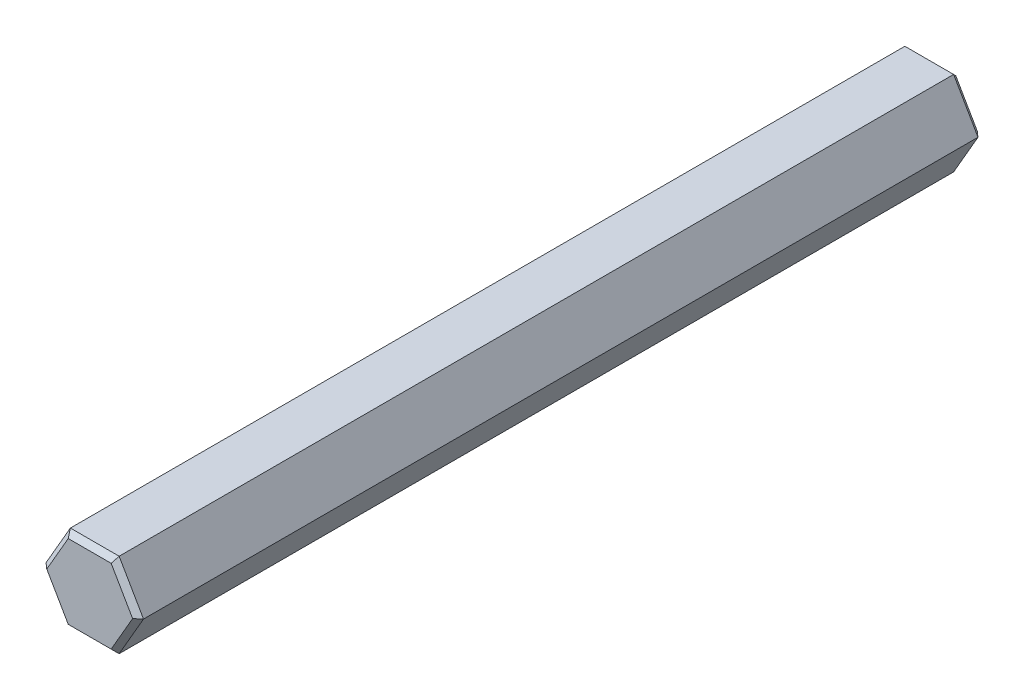
ISO-10303-21;
HEADER;
FILE_DESCRIPTION(('STEP AP214'),'2;1');
FILE_NAME('part.step','',(''),(''),'','','');
FILE_SCHEMA(('AUTOMOTIVE_DESIGN { 1 0 10303 214 1 1 1 1 }'));
ENDSEC;
DATA;
#1=APPLICATION_CONTEXT('core data for automotive mechanical design processes');
#2=APPLICATION_PROTOCOL_DEFINITION('international standard','automotive_design',2000,#1);
#3=PRODUCT_CONTEXT('',#1,'mechanical');
#4=PRODUCT('Part','Part','',(#3));
#5=PRODUCT_RELATED_PRODUCT_CATEGORY('part','',(#4));
#6=PRODUCT_DEFINITION_FORMATION('','',#4);
#7=PRODUCT_DEFINITION_CONTEXT('part definition',#1,'design');
#8=PRODUCT_DEFINITION('design','',#6,#7);
#9=PRODUCT_DEFINITION_SHAPE('','',#8);
#10=(LENGTH_UNIT() NAMED_UNIT(*) SI_UNIT(.MILLI.,.METRE.));
#11=(NAMED_UNIT(*) PLANE_ANGLE_UNIT() SI_UNIT($,.RADIAN.));
#12=(NAMED_UNIT(*) SI_UNIT($,.STERADIAN.) SOLID_ANGLE_UNIT());
#13=UNCERTAINTY_MEASURE_WITH_UNIT(LENGTH_MEASURE(1.E-05),#10,'distance_accuracy_value','');
#14=(GEOMETRIC_REPRESENTATION_CONTEXT(3) GLOBAL_UNCERTAINTY_ASSIGNED_CONTEXT((#13)) GLOBAL_UNIT_ASSIGNED_CONTEXT((#10,
#11,#12)) REPRESENTATION_CONTEXT('',''));
#15=CARTESIAN_POINT('',(0.,0.,0.));
#16=DIRECTION('',(0.,0.,1.));
#17=DIRECTION('',(1.,0.,0.));
#18=AXIS2_PLACEMENT_3D('',#15,#16,#17);
#19=CARTESIAN_POINT('',(-4.2527620828508,-4.572,0.381));
#20=DIRECTION('',(-0.612372435695795,-0.353553390593274,-0.707106781186548));
#21=DIRECTION('',(-0.755928946018454,0.,0.654653670707977));
#22=AXIS2_PLACEMENT_3D('',#19,#20,#21);
#23=PLANE('',#22);
#24=DIRECTION('',(0.499999999999998,-0.86602540378444,0.));
#25=VECTOR('',#24,1.);
#26=CARTESIAN_POINT('',(-6.45246660846325,0.,0.));
#27=LINE('',#26,#25);
#28=CARTESIAN_POINT('',(-6.45246660846325,0.,0.));
#29=VERTEX_POINT('',#28);
#30=CARTESIAN_POINT('',(-3.22623330423164,-5.588,0.));
#31=VERTEX_POINT('',#30);
#32=EDGE_CURVE('E104',#29,#31,#27,.T.);
#33=ORIENTED_EDGE('',*,*,#32,.T.);
#34=DIRECTION('',(0.377964473009231,0.654653670707976,-0.654653670707976));
#35=VECTOR('',#34,1.);
#36=CARTESIAN_POINT('',(-3.66617420935414,-6.35,0.762000000000001));
#37=LINE('',#36,#35);
#38=CARTESIAN_POINT('',(-3.66617420935414,-6.35,0.762000000000001));
#39=VERTEX_POINT('',#38);
#40=EDGE_CURVE('E146',#39,#31,#37,.T.);
#41=ORIENTED_EDGE('',*,*,#40,.F.);
#42=DIRECTION('',(0.5,-0.866025403784439,0.));
#43=VECTOR('',#42,1.);
#44=CARTESIAN_POINT('',(-3.66617420935414,-6.35,0.762000000000001));
#45=LINE('',#44,#43);
#46=CARTESIAN_POINT('',(-7.33234841870825,0.,0.761999999999996));
#47=VERTEX_POINT('',#46);
#48=EDGE_CURVE('E109',#47,#39,#45,.T.);
#49=ORIENTED_EDGE('',*,*,#48,.F.);
#50=DIRECTION('',(-0.755928946018455,0.,0.654653670707977));
#51=VECTOR('',#50,1.);
#52=CARTESIAN_POINT('',(-6.43151704155267,0.,-0.0181428571428556));
#53=LINE('',#52,#51);
#54=EDGE_CURVE('E19',#29,#47,#53,.T.);
#55=ORIENTED_EDGE('',*,*,#54,.F.);
#56=EDGE_LOOP('',(#33,#41,#49,#55));
#57=FACE_BOUND('',#56,.T.);
#58=ADVANCED_FACE('F16',(#57),#23,.T.);
#59=CARTESIAN_POINT('',(-6.08584918752785,1.397,0.381));
#60=DIRECTION('',(-0.612372435695794,0.353553390593274,-0.707106781186548));
#61=DIRECTION('',(-0.755928946018455,0.,0.654653670707977));
#62=AXIS2_PLACEMENT_3D('',#59,#60,#61);
#63=PLANE('',#62);
#64=DIRECTION('',(-0.499999999999998,-0.86602540378444,0.));
#65=VECTOR('',#64,1.);
#66=CARTESIAN_POINT('',(-3.22623330423164,5.588,0.));
#67=LINE('',#66,#65);
#68=CARTESIAN_POINT('',(-3.22623330423164,5.588,0.));
#69=VERTEX_POINT('',#68);
#70=EDGE_CURVE('E115',#69,#29,#67,.T.);
#71=ORIENTED_EDGE('',*,*,#70,.T.);
#72=ORIENTED_EDGE('',*,*,#54,.T.);
#73=DIRECTION('',(-0.5,-0.866025403784438,0.));
#74=VECTOR('',#73,1.);
#75=CARTESIAN_POINT('',(-7.33234841870825,0.,0.762));
#76=LINE('',#75,#74);
#77=CARTESIAN_POINT('',(-3.66617420935412,6.35,0.761999999999997));
#78=VERTEX_POINT('',#77);
#79=EDGE_CURVE('E178',#78,#47,#76,.T.);
#80=ORIENTED_EDGE('',*,*,#79,.F.);
#81=DIRECTION('',(-0.377964473009213,0.654653670707982,0.654653670707981));
#82=VECTOR('',#81,1.);
#83=CARTESIAN_POINT('',(-3.22623330423164,5.588,0.));
#84=LINE('',#83,#82);
#85=EDGE_CURVE('E118',#69,#78,#84,.T.);
#86=ORIENTED_EDGE('',*,*,#85,.F.);
#87=EDGE_LOOP('',(#71,#72,#80,#86));
#88=FACE_BOUND('',#87,.T.);
#89=ADVANCED_FACE('F116',(#88),#63,.T.);
#90=CARTESIAN_POINT('',(-6.08584918752785,1.397,126.619));
#91=DIRECTION('',(-0.612372435695794,0.353553390593274,0.707106781186548));
#92=DIRECTION('',(0.755928946018455,0.,0.654653670707977));
#93=AXIS2_PLACEMENT_3D('',#90,#91,#92);
#94=PLANE('',#93);
#95=DIRECTION('',(-0.5,-0.866025403784438,0.));
#96=VECTOR('',#95,1.);
#97=CARTESIAN_POINT('',(-7.33234841870825,0.,126.238));
#98=LINE('',#97,#96);
#99=CARTESIAN_POINT('',(-7.33234841870825,0.,126.238));
#100=VERTEX_POINT('',#99);
#101=CARTESIAN_POINT('',(-3.66617420935412,6.35,126.238));
#102=VERTEX_POINT('',#101);
#103=EDGE_CURVE('E167',#100,#102,#98,.F.);
#104=ORIENTED_EDGE('',*,*,#103,.F.);
#105=DIRECTION('',(0.755928946018454,0.,0.654653670707978));
#106=VECTOR('',#105,1.);
#107=CARTESIAN_POINT('',(-5.38403869602293,0.,127.925285714286));
#108=LINE('',#107,#106);
#109=CARTESIAN_POINT('',(-6.45246660846326,0.,127.));
#110=VERTEX_POINT('',#109);
#111=EDGE_CURVE('E113',#110,#100,#108,.F.);
#112=ORIENTED_EDGE('',*,*,#111,.F.);
#113=DIRECTION('',(-0.499999999999998,-0.86602540378444,0.));
#114=VECTOR('',#113,1.);
#115=CARTESIAN_POINT('',(-3.22623330423164,5.588,127.));
#116=LINE('',#115,#114);
#117=CARTESIAN_POINT('',(-3.22623330423164,5.588,127.));
#118=VERTEX_POINT('',#117);
#119=EDGE_CURVE('E242',#118,#110,#116,.T.);
#120=ORIENTED_EDGE('',*,*,#119,.F.);
#121=DIRECTION('',(0.377964473009218,-0.654653670707982,0.654653670707978));
#122=VECTOR('',#121,1.);
#123=CARTESIAN_POINT('',(-3.66617420935411,6.35,126.238));
#124=LINE('',#123,#122);
#125=EDGE_CURVE('E170',#102,#118,#124,.T.);
#126=ORIENTED_EDGE('',*,*,#125,.F.);
#127=EDGE_LOOP('',(#104,#112,#120,#126));
#128=FACE_BOUND('',#127,.T.);
#129=ADVANCED_FACE('F168',(#128),#94,.T.);
#130=CARTESIAN_POINT('',(-4.2527620828508,-4.572,126.619));
#131=DIRECTION('',(-0.612372435695795,-0.353553390593274,0.707106781186547));
#132=DIRECTION('',(0.755928946018454,0.,0.654653670707978));
#133=AXIS2_PLACEMENT_3D('',#130,#131,#132);
#134=PLANE('',#133);
#135=DIRECTION('',(0.5,-0.866025403784439,0.));
#136=VECTOR('',#135,1.);
#137=CARTESIAN_POINT('',(-3.66617420935414,-6.35,126.238));
#138=LINE('',#137,#136);
#139=CARTESIAN_POINT('',(-3.66617420935414,-6.35,126.238));
#140=VERTEX_POINT('',#139);
#141=EDGE_CURVE('E122',#140,#100,#138,.F.);
#142=ORIENTED_EDGE('',*,*,#141,.F.);
#143=DIRECTION('',(-0.377964473009236,-0.654653670707977,-0.654653670707973));
#144=VECTOR('',#143,1.);
#145=CARTESIAN_POINT('',(-3.22623330423164,-5.588,127.));
#146=LINE('',#145,#144);
#147=CARTESIAN_POINT('',(-3.22623330423164,-5.588,127.));
#148=VERTEX_POINT('',#147);
#149=EDGE_CURVE('E142',#148,#140,#146,.T.);
#150=ORIENTED_EDGE('',*,*,#149,.F.);
#151=DIRECTION('',(0.499999999999998,-0.86602540378444,0.));
#152=VECTOR('',#151,1.);
#153=CARTESIAN_POINT('',(-6.45246660846325,0.,127.));
#154=LINE('',#153,#152);
#155=EDGE_CURVE('E153',#110,#148,#154,.T.);
#156=ORIENTED_EDGE('',*,*,#155,.F.);
#157=ORIENTED_EDGE('',*,*,#111,.T.);
#158=EDGE_LOOP('',(#142,#150,#156,#157));
#159=FACE_BOUND('',#158,.T.);
#160=ADVANCED_FACE('F151',(#159),#134,.T.);
#161=CARTESIAN_POINT('',(1.83308710467706,-5.969,0.381));
#162=DIRECTION('',(0.,-0.707106781186547,-0.707106781186548));
#163=DIRECTION('',(0.,0.707106781186548,-0.707106781186547));
#164=AXIS2_PLACEMENT_3D('',#161,#162,#163);
#165=PLANE('',#164);
#166=DIRECTION('',(1.,0.,0.));
#167=VECTOR('',#166,1.);
#168=CARTESIAN_POINT('',(0.,-5.588,0.));
#169=LINE('',#168,#167);
#170=CARTESIAN_POINT('',(3.22623330423161,-5.588,0.));
#171=VERTEX_POINT('',#170);
#172=EDGE_CURVE('E128',#31,#171,#169,.T.);
#173=ORIENTED_EDGE('',*,*,#172,.T.);
#174=DIRECTION('',(-0.37796447300923,0.654653670707975,-0.654653670707977));
#175=VECTOR('',#174,1.);
#176=CARTESIAN_POINT('',(3.66617420935412,-6.35000000000001,0.761999999999994));
#177=LINE('',#176,#175);
#178=CARTESIAN_POINT('',(3.66617420935411,-6.35,0.761999999999998));
#179=VERTEX_POINT('',#178);
#180=EDGE_CURVE('E230',#179,#171,#177,.T.);
#181=ORIENTED_EDGE('',*,*,#180,.F.);
#182=DIRECTION('',(1.,0.,0.));
#183=VECTOR('',#182,1.);
#184=CARTESIAN_POINT('',(3.66617420935411,-6.35,0.762));
#185=LINE('',#184,#183);
#186=EDGE_CURVE('E217',#39,#179,#185,.T.);
#187=ORIENTED_EDGE('',*,*,#186,.F.);
#188=ORIENTED_EDGE('',*,*,#40,.T.);
#189=EDGE_LOOP('',(#173,#181,#187,#188));
#190=FACE_BOUND('',#189,.T.);
#191=ADVANCED_FACE('F406',(#190),#165,.T.);
#192=CARTESIAN_POINT('',(1.83308710467706,-5.969,126.619));
#193=DIRECTION('',(0.,-0.707106781186548,0.707106781186548));
#194=DIRECTION('',(0.,-0.707106781186548,-0.707106781186548));
#195=AXIS2_PLACEMENT_3D('',#192,#193,#194);
#196=PLANE('',#195);
#197=DIRECTION('',(1.,0.,0.));
#198=VECTOR('',#197,1.);
#199=CARTESIAN_POINT('',(3.66617420935411,-6.35,126.238));
#200=LINE('',#199,#198);
#201=CARTESIAN_POINT('',(3.66617420935412,-6.35,126.238));
#202=VERTEX_POINT('',#201);
#203=EDGE_CURVE('E211',#202,#140,#200,.F.);
#204=ORIENTED_EDGE('',*,*,#203,.F.);
#205=DIRECTION('',(0.377964473009227,-0.654653670707971,-0.654653670707983));
#206=VECTOR('',#205,1.);
#207=CARTESIAN_POINT('',(3.22623330423162,-5.58800000000001,127.));
#208=LINE('',#207,#206);
#209=CARTESIAN_POINT('',(3.22623330423161,-5.588,127.));
#210=VERTEX_POINT('',#209);
#211=EDGE_CURVE('E221',#210,#202,#208,.T.);
#212=ORIENTED_EDGE('',*,*,#211,.F.);
#213=DIRECTION('',(1.,0.,0.));
#214=VECTOR('',#213,1.);
#215=CARTESIAN_POINT('',(0.,-5.588,127.));
#216=LINE('',#215,#214);
#217=EDGE_CURVE('E237',#148,#210,#216,.T.);
#218=ORIENTED_EDGE('',*,*,#217,.F.);
#219=ORIENTED_EDGE('',*,*,#149,.T.);
#220=EDGE_LOOP('',(#204,#212,#218,#219));
#221=FACE_BOUND('',#220,.T.);
#222=ADVANCED_FACE('F399',(#221),#196,.T.);
#223=CARTESIAN_POINT('',(-3.66617420935414,-6.35,0.));
#224=DIRECTION('',(-0.866025403784439,-0.5,0.));
#225=DIRECTION('',(0.5,-0.866025403784439,0.));
#226=AXIS2_PLACEMENT_3D('',#223,#224,#225);
#227=PLANE('',#226);
#228=ORIENTED_EDGE('',*,*,#141,.T.);
#229=DIRECTION('',(0.,0.,1.));
#230=VECTOR('',#229,1.);
#231=CARTESIAN_POINT('',(-7.33234841870825,0.,0.));
#232=LINE('',#231,#230);
#233=EDGE_CURVE('E161',#47,#100,#232,.T.);
#234=ORIENTED_EDGE('',*,*,#233,.F.);
#235=ORIENTED_EDGE('',*,*,#48,.T.);
#236=DIRECTION('',(0.,0.,-1.));
#237=VECTOR('',#236,1.);
#238=CARTESIAN_POINT('',(-3.66617420935414,-6.35,0.));
#239=LINE('',#238,#237);
#240=EDGE_CURVE('E164',#140,#39,#239,.T.);
#241=ORIENTED_EDGE('',*,*,#240,.F.);
#242=EDGE_LOOP('',(#228,#234,#235,#241));
#243=FACE_BOUND('',#242,.T.);
#244=ADVANCED_FACE('F159',(#243),#227,.T.);
#245=CARTESIAN_POINT('',(0.,0.,0.));
#246=DIRECTION('',(0.,0.,1.));
#247=DIRECTION('',(1.,0.,0.));
#248=AXIS2_PLACEMENT_3D('',#245,#246,#247);
#249=PLANE('',#248);
#250=DIRECTION('',(-0.499999999999999,0.866025403784439,0.));
#251=VECTOR('',#250,1.);
#252=CARTESIAN_POINT('',(6.45246660846326,0.,0.));
#253=LINE('',#252,#251);
#254=CARTESIAN_POINT('',(6.45246660846326,0.,0.));
#255=VERTEX_POINT('',#254);
#256=CARTESIAN_POINT('',(3.22623330423164,5.588,0.));
#257=VERTEX_POINT('',#256);
#258=EDGE_CURVE('E193',#255,#257,#253,.T.);
#259=ORIENTED_EDGE('',*,*,#258,.F.);
#260=DIRECTION('',(0.500000000000001,0.866025403784438,0.));
#261=VECTOR('',#260,1.);
#262=CARTESIAN_POINT('',(3.22623330423162,-5.58800000000001,0.));
#263=LINE('',#262,#261);
#264=EDGE_CURVE('E195',#171,#255,#263,.T.);
#265=ORIENTED_EDGE('',*,*,#264,.F.);
#266=ORIENTED_EDGE('',*,*,#172,.F.);
#267=ORIENTED_EDGE('',*,*,#32,.F.);
#268=ORIENTED_EDGE('',*,*,#70,.F.);
#269=DIRECTION('',(1.,0.,0.));
#270=VECTOR('',#269,1.);
#271=CARTESIAN_POINT('',(-1.83308710467706,5.588,0.));
#272=LINE('',#271,#270);
#273=EDGE_CURVE('E133',#257,#69,#272,.F.);
#274=ORIENTED_EDGE('',*,*,#273,.F.);
#275=EDGE_LOOP('',(#259,#265,#266,#267,#268,#274));
#276=FACE_BOUND('',#275,.T.);
#277=ADVANCED_FACE('F126',(#276),#249,.F.);
#278=CARTESIAN_POINT('',(-1.83308710467706,5.969,0.381));
#279=DIRECTION('',(0.,0.707106781186547,-0.707106781186548));
#280=DIRECTION('',(0.,0.707106781186548,0.707106781186547));
#281=AXIS2_PLACEMENT_3D('',#278,#279,#280);
#282=PLANE('',#281);
#283=ORIENTED_EDGE('',*,*,#273,.T.);
#284=ORIENTED_EDGE('',*,*,#85,.T.);
#285=DIRECTION('',(1.,0.,0.));
#286=VECTOR('',#285,1.);
#287=CARTESIAN_POINT('',(-3.66617420935411,6.35,0.762));
#288=LINE('',#287,#286);
#289=CARTESIAN_POINT('',(3.66617420935414,6.35,0.762));
#290=VERTEX_POINT('',#289);
#291=EDGE_CURVE('E295',#290,#78,#288,.F.);
#292=ORIENTED_EDGE('',*,*,#291,.F.);
#293=DIRECTION('',(0.377964473009229,0.654653670707975,0.654653670707978));
#294=VECTOR('',#293,1.);
#295=CARTESIAN_POINT('',(3.22623330423164,5.588,0.));
#296=LINE('',#295,#294);
#297=EDGE_CURVE('E191',#257,#290,#296,.T.);
#298=ORIENTED_EDGE('',*,*,#297,.F.);
#299=EDGE_LOOP('',(#283,#284,#292,#298));
#300=FACE_BOUND('',#299,.T.);
#301=ADVANCED_FACE('F189',(#300),#282,.T.);
#302=CARTESIAN_POINT('',(-7.33234841870825,0.,0.));
#303=DIRECTION('',(-0.866025403784438,0.5,0.));
#304=DIRECTION('',(-0.5,-0.866025403784438,0.));
#305=AXIS2_PLACEMENT_3D('',#302,#303,#304);
#306=PLANE('',#305);
#307=ORIENTED_EDGE('',*,*,#103,.T.);
#308=DIRECTION('',(0.,0.,1.));
#309=VECTOR('',#308,1.);
#310=CARTESIAN_POINT('',(-3.66617420935411,6.35,0.));
#311=LINE('',#310,#309);
#312=EDGE_CURVE('E263',#78,#102,#311,.T.);
#313=ORIENTED_EDGE('',*,*,#312,.F.);
#314=ORIENTED_EDGE('',*,*,#79,.T.);
#315=ORIENTED_EDGE('',*,*,#233,.T.);
#316=EDGE_LOOP('',(#307,#313,#314,#315));
#317=FACE_BOUND('',#316,.T.);
#318=ADVANCED_FACE('F177',(#317),#306,.T.);
#319=CARTESIAN_POINT('',(-1.83308710467706,5.969,126.619));
#320=DIRECTION('',(0.,0.707106781186548,0.707106781186548));
#321=DIRECTION('',(0.,-0.707106781186548,0.707106781186548));
#322=AXIS2_PLACEMENT_3D('',#319,#320,#321);
#323=PLANE('',#322);
#324=DIRECTION('',(1.,0.,0.));
#325=VECTOR('',#324,1.);
#326=CARTESIAN_POINT('',(-3.66617420935411,6.35,126.238));
#327=LINE('',#326,#325);
#328=CARTESIAN_POINT('',(3.66617420935414,6.35,126.238));
#329=VERTEX_POINT('',#328);
#330=EDGE_CURVE('E251',#102,#329,#327,.T.);
#331=ORIENTED_EDGE('',*,*,#330,.F.);
#332=ORIENTED_EDGE('',*,*,#125,.T.);
#333=DIRECTION('',(1.,0.,0.));
#334=VECTOR('',#333,1.);
#335=CARTESIAN_POINT('',(0.,5.588,127.));
#336=LINE('',#335,#334);
#337=CARTESIAN_POINT('',(3.22623330423164,5.58800000000001,127.));
#338=VERTEX_POINT('',#337);
#339=EDGE_CURVE('E233',#338,#118,#336,.F.);
#340=ORIENTED_EDGE('',*,*,#339,.F.);
#341=DIRECTION('',(0.377964473009236,0.654653670707976,-0.654653670707973));
#342=VECTOR('',#341,1.);
#343=CARTESIAN_POINT('',(3.22623330423164,5.58800000000001,127.));
#344=LINE('',#343,#342);
#345=EDGE_CURVE('E175',#338,#329,#344,.T.);
#346=ORIENTED_EDGE('',*,*,#345,.T.);
#347=EDGE_LOOP('',(#331,#332,#340,#346));
#348=FACE_BOUND('',#347,.T.);
#349=ADVANCED_FACE('F250',(#348),#323,.T.);
#350=CARTESIAN_POINT('',(0.,0.,127.));
#351=DIRECTION('',(0.,0.,1.));
#352=DIRECTION('',(1.,0.,0.));
#353=AXIS2_PLACEMENT_3D('',#350,#351,#352);
#354=PLANE('',#353);
#355=DIRECTION('',(0.499999999999997,-0.86602540378444,0.));
#356=VECTOR('',#355,1.);
#357=CARTESIAN_POINT('',(3.22623330423165,5.58800000000001,127.));
#358=LINE('',#357,#356);
#359=CARTESIAN_POINT('',(6.45246660846326,0.,127.));
#360=VERTEX_POINT('',#359);
#361=EDGE_CURVE('E265',#338,#360,#358,.T.);
#362=ORIENTED_EDGE('',*,*,#361,.F.);
#363=ORIENTED_EDGE('',*,*,#339,.T.);
#364=ORIENTED_EDGE('',*,*,#119,.T.);
#365=ORIENTED_EDGE('',*,*,#155,.T.);
#366=ORIENTED_EDGE('',*,*,#217,.T.);
#367=DIRECTION('',(-0.500000000000002,-0.866025403784437,0.));
#368=VECTOR('',#367,1.);
#369=CARTESIAN_POINT('',(6.45246660846326,0.,127.));
#370=LINE('',#369,#368);
#371=EDGE_CURVE('E224',#360,#210,#370,.T.);
#372=ORIENTED_EDGE('',*,*,#371,.F.);
#373=EDGE_LOOP('',(#362,#363,#364,#365,#366,#372));
#374=FACE_BOUND('',#373,.T.);
#375=ADVANCED_FACE('F301',(#374),#354,.T.);
#376=CARTESIAN_POINT('',(6.08584918752785,-1.397,0.381));
#377=DIRECTION('',(0.612372435695794,-0.353553390593274,-0.707106781186548));
#378=DIRECTION('',(-0.755928946018455,0.,-0.654653670707977));
#379=AXIS2_PLACEMENT_3D('',#376,#377,#378);
#380=PLANE('',#379);
#381=ORIENTED_EDGE('',*,*,#264,.T.);
#382=DIRECTION('',(-0.755928946018454,0.,-0.654653670707978));
#383=VECTOR('',#382,1.);
#384=CARTESIAN_POINT('',(5.38403869602293,0.,-0.925285714285716));
#385=LINE('',#384,#383);
#386=CARTESIAN_POINT('',(7.33234841870825,0.,0.761999999999998));
#387=VERTEX_POINT('',#386);
#388=EDGE_CURVE('E199',#387,#255,#385,.T.);
#389=ORIENTED_EDGE('',*,*,#388,.F.);
#390=DIRECTION('',(0.500000000000001,0.866025403784438,0.));
#391=VECTOR('',#390,1.);
#392=CARTESIAN_POINT('',(7.33234841870825,0.,0.762));
#393=LINE('',#392,#391);
#394=EDGE_CURVE('E286',#179,#387,#393,.T.);
#395=ORIENTED_EDGE('',*,*,#394,.F.);
#396=ORIENTED_EDGE('',*,*,#180,.T.);
#397=EDGE_LOOP('',(#381,#389,#395,#396));
#398=FACE_BOUND('',#397,.T.);
#399=ADVANCED_FACE('F307',(#398),#380,.T.);
#400=CARTESIAN_POINT('',(6.08584918752785,-1.397,126.619));
#401=DIRECTION('',(0.612372435695795,-0.353553390593274,0.707106781186547));
#402=DIRECTION('',(0.755928946018454,0.,-0.654653670707978));
#403=AXIS2_PLACEMENT_3D('',#400,#401,#402);
#404=PLANE('',#403);
#405=DIRECTION('',(0.500000000000001,0.866025403784438,0.));
#406=VECTOR('',#405,1.);
#407=CARTESIAN_POINT('',(7.33234841870825,0.,126.238));
#408=LINE('',#407,#406);
#409=CARTESIAN_POINT('',(7.33234841870825,0.,126.238));
#410=VERTEX_POINT('',#409);
#411=EDGE_CURVE('E35',#410,#202,#408,.F.);
#412=ORIENTED_EDGE('',*,*,#411,.F.);
#413=DIRECTION('',(0.755928946018454,0.,-0.654653670707978));
#414=VECTOR('',#413,1.);
#415=CARTESIAN_POINT('',(5.38403869602293,0.,127.925285714286));
#416=LINE('',#415,#414);
#417=EDGE_CURVE('E269',#360,#410,#416,.T.);
#418=ORIENTED_EDGE('',*,*,#417,.F.);
#419=ORIENTED_EDGE('',*,*,#371,.T.);
#420=ORIENTED_EDGE('',*,*,#211,.T.);
#421=EDGE_LOOP('',(#412,#418,#419,#420));
#422=FACE_BOUND('',#421,.T.);
#423=ADVANCED_FACE('F304',(#422),#404,.T.);
#424=CARTESIAN_POINT('',(3.66617420935411,-6.35,0.));
#425=DIRECTION('',(0.,-1.,0.));
#426=DIRECTION('',(0.,0.,-1.));
#427=AXIS2_PLACEMENT_3D('',#424,#425,#426);
#428=PLANE('',#427);
#429=ORIENTED_EDGE('',*,*,#203,.T.);
#430=ORIENTED_EDGE('',*,*,#240,.T.);
#431=ORIENTED_EDGE('',*,*,#186,.T.);
#432=DIRECTION('',(0.,0.,1.));
#433=VECTOR('',#432,1.);
#434=CARTESIAN_POINT('',(3.66617420935412,-6.35,0.));
#435=LINE('',#434,#433);
#436=EDGE_CURVE('E278',#202,#179,#435,.F.);
#437=ORIENTED_EDGE('',*,*,#436,.F.);
#438=EDGE_LOOP('',(#429,#430,#431,#437));
#439=FACE_BOUND('',#438,.T.);
#440=ADVANCED_FACE('F306',(#439),#428,.T.);
#441=CARTESIAN_POINT('',(4.2527620828508,4.572,0.381));
#442=DIRECTION('',(0.612372435695795,0.353553390593274,-0.707106781186547));
#443=DIRECTION('',(-0.755928946018454,0.,-0.654653670707978));
#444=AXIS2_PLACEMENT_3D('',#441,#442,#443);
#445=PLANE('',#444);
#446=ORIENTED_EDGE('',*,*,#258,.T.);
#447=ORIENTED_EDGE('',*,*,#297,.T.);
#448=DIRECTION('',(-0.5,0.866025403784439,0.));
#449=VECTOR('',#448,1.);
#450=CARTESIAN_POINT('',(3.66617420935414,6.35,0.762000000000001));
#451=LINE('',#450,#449);
#452=EDGE_CURVE('E204',#387,#290,#451,.T.);
#453=ORIENTED_EDGE('',*,*,#452,.F.);
#454=ORIENTED_EDGE('',*,*,#388,.T.);
#455=EDGE_LOOP('',(#446,#447,#453,#454));
#456=FACE_BOUND('',#455,.T.);
#457=ADVANCED_FACE('F202',(#456),#445,.T.);
#458=CARTESIAN_POINT('',(-3.66617420935411,6.35,0.));
#459=DIRECTION('',(0.,1.,0.));
#460=DIRECTION('',(0.,0.,1.));
#461=AXIS2_PLACEMENT_3D('',#458,#459,#460);
#462=PLANE('',#461);
#463=ORIENTED_EDGE('',*,*,#330,.T.);
#464=DIRECTION('',(0.,0.,1.));
#465=VECTOR('',#464,1.);
#466=CARTESIAN_POINT('',(3.66617420935414,6.35,0.));
#467=LINE('',#466,#465);
#468=EDGE_CURVE('E262',#290,#329,#467,.T.);
#469=ORIENTED_EDGE('',*,*,#468,.F.);
#470=ORIENTED_EDGE('',*,*,#291,.T.);
#471=ORIENTED_EDGE('',*,*,#312,.T.);
#472=EDGE_LOOP('',(#463,#469,#470,#471));
#473=FACE_BOUND('',#472,.T.);
#474=ADVANCED_FACE('F259',(#473),#462,.T.);
#475=CARTESIAN_POINT('',(4.2527620828508,4.572,126.619));
#476=DIRECTION('',(0.612372435695795,0.353553390593274,0.707106781186547));
#477=DIRECTION('',(0.755928946018454,0.,-0.654653670707978));
#478=AXIS2_PLACEMENT_3D('',#475,#476,#477);
#479=PLANE('',#478);
#480=DIRECTION('',(-0.5,0.866025403784439,0.));
#481=VECTOR('',#480,1.);
#482=CARTESIAN_POINT('',(3.66617420935414,6.35,126.238));
#483=LINE('',#482,#481);
#484=EDGE_CURVE('E26',#329,#410,#483,.F.);
#485=ORIENTED_EDGE('',*,*,#484,.F.);
#486=ORIENTED_EDGE('',*,*,#345,.F.);
#487=ORIENTED_EDGE('',*,*,#361,.T.);
#488=ORIENTED_EDGE('',*,*,#417,.T.);
#489=EDGE_LOOP('',(#485,#486,#487,#488));
#490=FACE_BOUND('',#489,.T.);
#491=ADVANCED_FACE('F268',(#490),#479,.T.);
#492=CARTESIAN_POINT('',(7.33234841870825,0.,0.));
#493=DIRECTION('',(0.866025403784438,-0.500000000000001,0.));
#494=DIRECTION('',(0.500000000000001,0.866025403784438,0.));
#495=AXIS2_PLACEMENT_3D('',#492,#493,#494);
#496=PLANE('',#495);
#497=ORIENTED_EDGE('',*,*,#411,.T.);
#498=ORIENTED_EDGE('',*,*,#436,.T.);
#499=ORIENTED_EDGE('',*,*,#394,.T.);
#500=DIRECTION('',(0.,0.,1.));
#501=VECTOR('',#500,1.);
#502=CARTESIAN_POINT('',(7.33234841870826,0.,0.));
#503=LINE('',#502,#501);
#504=EDGE_CURVE('E11',#410,#387,#503,.F.);
#505=ORIENTED_EDGE('',*,*,#504,.F.);
#506=EDGE_LOOP('',(#497,#498,#499,#505));
#507=FACE_BOUND('',#506,.T.);
#508=ADVANCED_FACE('F318',(#507),#496,.T.);
#509=CARTESIAN_POINT('',(3.66617420935414,6.35,0.));
#510=DIRECTION('',(0.866025403784439,0.5,0.));
#511=DIRECTION('',(-0.5,0.866025403784439,0.));
#512=AXIS2_PLACEMENT_3D('',#509,#510,#511);
#513=PLANE('',#512);
#514=ORIENTED_EDGE('',*,*,#484,.T.);
#515=ORIENTED_EDGE('',*,*,#504,.T.);
#516=ORIENTED_EDGE('',*,*,#452,.T.);
#517=ORIENTED_EDGE('',*,*,#468,.T.);
#518=EDGE_LOOP('',(#514,#515,#516,#517));
#519=FACE_BOUND('',#518,.T.);
#520=ADVANCED_FACE('F274',(#519),#513,.T.);
#521=CLOSED_SHELL('',(#58,#89,#129,#160,#191,#222,#244,#277,#301,#318,#349,#375,#399,#423,#440,
#457,#474,#491,#508,#520));
#522=MANIFOLD_SOLID_BREP('B1',#521);
#523=ADVANCED_BREP_SHAPE_REPRESENTATION('',(#18,#522),#14);
#524=SHAPE_DEFINITION_REPRESENTATION(#9,#523);
ENDSEC;
END-ISO-10303-21;
